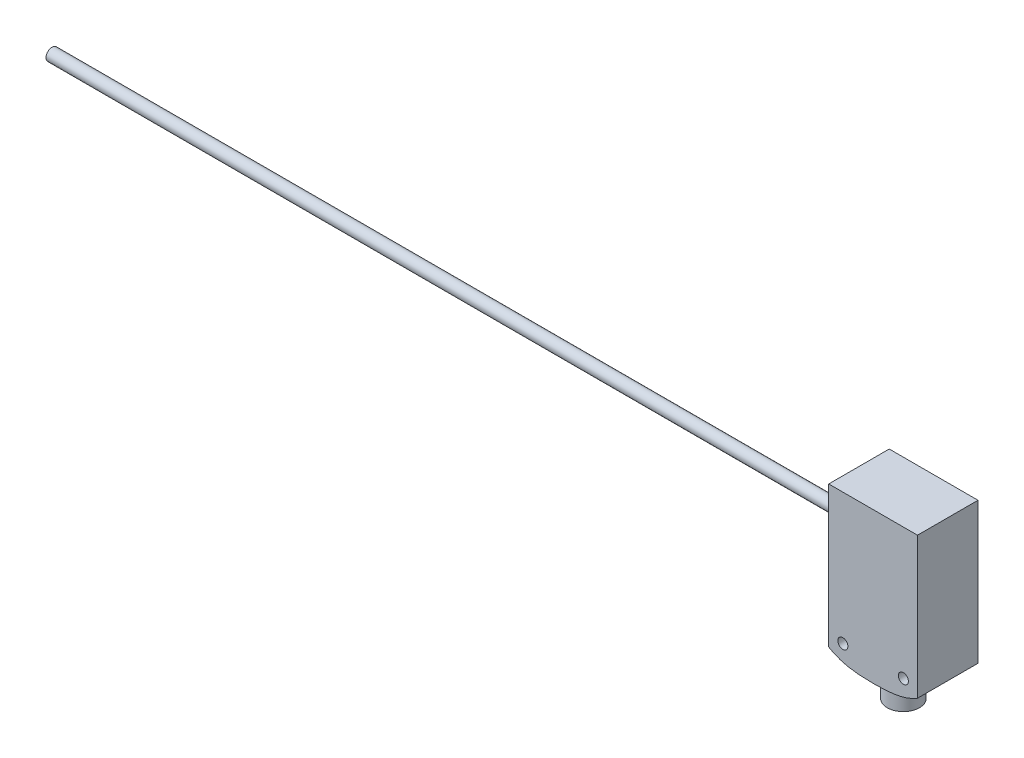
ISO-10303-21;
HEADER;
FILE_DESCRIPTION(('STEP AP214'),'2;1');
FILE_NAME('part.step','',(''),(''),'','','');
FILE_SCHEMA(('AUTOMOTIVE_DESIGN { 1 0 10303 214 1 1 1 1 }'));
ENDSEC;
DATA;
#1=APPLICATION_CONTEXT('core data for automotive mechanical design processes');
#2=APPLICATION_PROTOCOL_DEFINITION('international standard','automotive_design',2000,#1);
#3=PRODUCT_CONTEXT('',#1,'mechanical');
#4=PRODUCT('Part','Part','',(#3));
#5=PRODUCT_RELATED_PRODUCT_CATEGORY('part','',(#4));
#6=PRODUCT_DEFINITION_FORMATION('','',#4);
#7=PRODUCT_DEFINITION_CONTEXT('part definition',#1,'design');
#8=PRODUCT_DEFINITION('design','',#6,#7);
#9=PRODUCT_DEFINITION_SHAPE('','',#8);
#10=(LENGTH_UNIT() NAMED_UNIT(*) SI_UNIT(.MILLI.,.METRE.));
#11=(NAMED_UNIT(*) PLANE_ANGLE_UNIT() SI_UNIT($,.RADIAN.));
#12=(NAMED_UNIT(*) SI_UNIT($,.STERADIAN.) SOLID_ANGLE_UNIT());
#13=UNCERTAINTY_MEASURE_WITH_UNIT(LENGTH_MEASURE(1.E-05),#10,'distance_accuracy_value','');
#14=(GEOMETRIC_REPRESENTATION_CONTEXT(3) GLOBAL_UNCERTAINTY_ASSIGNED_CONTEXT((#13)) GLOBAL_UNIT_ASSIGNED_CONTEXT((#10,
#11,#12)) REPRESENTATION_CONTEXT('',''));
#15=CARTESIAN_POINT('',(0.,0.,0.));
#16=DIRECTION('',(0.,0.,1.));
#17=DIRECTION('',(1.,0.,0.));
#18=AXIS2_PLACEMENT_3D('',#15,#16,#17);
#19=CARTESIAN_POINT('',(-211.,32.8,7.5));
#20=DIRECTION('',(1.,0.,0.));
#21=DIRECTION('',(0.,0.,-1.));
#22=AXIS2_PLACEMENT_3D('',#19,#20,#21);
#23=CYLINDRICAL_SURFACE('',#22,1.5);
#24=CARTESIAN_POINT('',(-211.,32.8,7.5));
#25=DIRECTION('',(-1.,0.,0.));
#26=DIRECTION('',(0.,0.,1.));
#27=AXIS2_PLACEMENT_3D('',#24,#25,#26);
#28=CIRCLE('',#27,1.5);
#29=CARTESIAN_POINT('',(-211.,32.8,9.));
#30=VERTEX_POINT('',#29);
#31=EDGE_CURVE('E11',#30,#30,#28,.T.);
#32=ORIENTED_EDGE('',*,*,#31,.F.);
#33=EDGE_LOOP('',(#32));
#34=FACE_BOUND('',#33,.T.);
#35=CARTESIAN_POINT('',(-11.,32.8,7.5));
#36=DIRECTION('',(-1.,0.,0.));
#37=DIRECTION('',(0.,0.,1.));
#38=AXIS2_PLACEMENT_3D('',#35,#36,#37);
#39=CIRCLE('',#38,1.5);
#40=CARTESIAN_POINT('',(-11.,32.8,9.));
#41=VERTEX_POINT('',#40);
#42=EDGE_CURVE('E51',#41,#41,#39,.T.);
#43=ORIENTED_EDGE('',*,*,#42,.T.);
#44=EDGE_LOOP('',(#43));
#45=FACE_BOUND('',#44,.T.);
#46=ADVANCED_FACE('F48',(#34,#45),#23,.T.);
#47=CARTESIAN_POINT('',(-211.,32.8,7.5));
#48=DIRECTION('',(-1.,0.,0.));
#49=DIRECTION('',(0.,0.,1.));
#50=AXIS2_PLACEMENT_3D('',#47,#48,#49);
#51=PLANE('',#50);
#52=ORIENTED_EDGE('',*,*,#31,.T.);
#53=EDGE_LOOP('',(#52));
#54=FACE_BOUND('',#53,.T.);
#55=ADVANCED_FACE('F63',(#54),#51,.T.);
#56=CARTESIAN_POINT('',(-11.,32.8,7.5));
#57=DIRECTION('',(-1.,0.,0.));
#58=DIRECTION('',(0.,0.,1.));
#59=AXIS2_PLACEMENT_3D('',#56,#57,#58);
#60=PLANE('',#59);
#61=ORIENTED_EDGE('',*,*,#42,.F.);
#62=EDGE_LOOP('',(#61));
#63=FACE_BOUND('',#62,.T.);
#64=ADVANCED_FACE('F61',(#63),#60,.F.);
#65=CLOSED_SHELL('',(#46,#55,#64));
#66=MANIFOLD_SOLID_BREP('B2',#65);
#67=CARTESIAN_POINT('',(11.,9.3,0.));
#68=CARTESIAN_POINT('',(7.62537457172211,7.23673007694766,0.));
#69=CARTESIAN_POINT('',(0.,6.76326992305233,0.));
#70=CARTESIAN_POINT('',(-7.62537457172212,7.23673007694767,0.));
#71=CARTESIAN_POINT('',(-11.,9.3,0.));
#72=B_SPLINE_CURVE_WITH_KNOTS('',3,(#67,#68,#69,#70,#71),.UNSPECIFIED.,.F.,.F.,(4,1,4),(0.,0.5,
1.),.UNSPECIFIED.);
#73=DIRECTION('',(0.,0.,1.));
#74=VECTOR('',#73,1.);
#75=SURFACE_OF_LINEAR_EXTRUSION('',#72,#74);
#76=CARTESIAN_POINT('',(11.,9.3,15.));
#77=CARTESIAN_POINT('',(7.62537457172211,7.23673007694766,15.));
#78=CARTESIAN_POINT('',(0.,6.76326992305233,15.));
#79=CARTESIAN_POINT('',(-7.62537457172212,7.23673007694767,15.));
#80=CARTESIAN_POINT('',(-11.,9.3,15.));
#81=B_SPLINE_CURVE_WITH_KNOTS('',3,(#76,#77,#78,#79,#80),.UNSPECIFIED.,.F.,.F.,(4,1,4),(0.,0.5,
1.),.UNSPECIFIED.);
#82=CARTESIAN_POINT('',(11.,9.3,15.));
#83=VERTEX_POINT('',#82);
#84=CARTESIAN_POINT('',(-11.,9.3,15.));
#85=VERTEX_POINT('',#84);
#86=EDGE_CURVE('E121',#83,#85,#81,.T.);
#87=ORIENTED_EDGE('',*,*,#86,.T.);
#88=DIRECTION('',(0.,0.,1.));
#89=VECTOR('',#88,1.);
#90=CARTESIAN_POINT('',(-11.,9.3,0.));
#91=LINE('',#90,#89);
#92=CARTESIAN_POINT('',(-11.,9.3,0.));
#93=VERTEX_POINT('',#92);
#94=EDGE_CURVE('E210',#93,#85,#91,.T.);
#95=ORIENTED_EDGE('',*,*,#94,.F.);
#96=CARTESIAN_POINT('',(11.,9.3,0.));
#97=VERTEX_POINT('',#96);
#98=EDGE_CURVE('E204',#97,#93,#72,.T.);
#99=ORIENTED_EDGE('',*,*,#98,.F.);
#100=DIRECTION('',(0.,0.,1.));
#101=VECTOR('',#100,1.);
#102=CARTESIAN_POINT('',(11.,9.3,0.));
#103=LINE('',#102,#101);
#104=EDGE_CURVE('E289',#97,#83,#103,.T.);
#105=ORIENTED_EDGE('',*,*,#104,.T.);
#106=EDGE_LOOP('',(#87,#95,#99,#105));
#107=FACE_BOUND('',#106,.T.);
#108=CARTESIAN_POINT('',(0.,7.0000000000025,3.5));
#109=CARTESIAN_POINT('',(0.22439439935221,7.00000125301037,3.50000968765886));
#110=CARTESIAN_POINT('',(0.448941548053714,7.00083032711492,3.51894492720915));
#111=CARTESIAN_POINT('',(0.891836619614709,7.00469064216585,3.59421070501428));
#112=CARTESIAN_POINT('',(1.1101773529625,7.00772433691042,3.65058290551943));
#113=CARTESIAN_POINT('',(1.53419118893364,7.01619340560287,3.79909822405339));
#114=CARTESIAN_POINT('',(1.73987011840827,7.0216276652749,3.89122474350967));
#115=CARTESIAN_POINT('',(2.13277455188842,7.03464465181378,4.10858788356927));
#116=CARTESIAN_POINT('',(2.32000405926751,7.04222691119244,4.23381729929993));
#117=CARTESIAN_POINT('',(2.67093026662562,7.0588316517902,4.51393713770192));
#118=CARTESIAN_POINT('',(2.83460942713917,7.06785519598146,4.66884946899593));
#119=CARTESIAN_POINT('',(3.1336860014841,7.08624554735671,5.00391394182719));
#120=CARTESIAN_POINT('',(3.2690818212955,7.09561237385279,5.18406750497883));
#121=CARTESIAN_POINT('',(3.50804333172789,7.11341492256552,5.5649826127234));
#122=CARTESIAN_POINT('',(3.61153753175449,7.12184852675559,5.76578911714154));
#123=CARTESIAN_POINT('',(3.78332915841526,7.13649328392245,6.18200731252531));
#124=CARTESIAN_POINT('',(3.8516274551061,7.14270449183659,6.39741864230489));
#125=CARTESIAN_POINT('',(3.95094921563395,7.15191460960394,6.8362865058816));
#126=CARTESIAN_POINT('',(3.98204681856726,7.15491990737435,7.05972612069069));
#127=CARTESIAN_POINT('',(4.00630212930006,7.15725422466925,7.50867095156947));
#128=CARTESIAN_POINT('',(3.9994608596348,7.15658334327479,7.73417611180468));
#129=CARTESIAN_POINT('',(3.94814007204997,7.15168420569334,8.17995742511222));
#130=CARTESIAN_POINT('',(3.90380207147854,7.14746932534535,8.40025004185015));
#131=CARTESIAN_POINT('',(3.77895946361968,7.13617137316259,8.83026003320635));
#132=CARTESIAN_POINT('',(3.69845402501207,7.12908823540039,9.03997716462045));
#133=CARTESIAN_POINT('',(3.50337611853196,7.11312735717629,9.4433607158157));
#134=CARTESIAN_POINT('',(3.38873576309751,7.10424605188845,9.636994157503));
#135=CARTESIAN_POINT('',(3.12867708961996,7.08599077533882,10.0023301151966));
#136=CARTESIAN_POINT('',(2.98325818697742,7.07661679472183,10.1740322145455));
#137=CARTESIAN_POINT('',(2.66512868247824,7.05858666461076,10.4912768195617));
#138=CARTESIAN_POINT('',(2.49232028814389,7.04993326353616,10.6367214348943));
#139=CARTESIAN_POINT('',(2.12466316535358,7.03436825781713,10.8965368479663));
#140=CARTESIAN_POINT('',(1.92981482043195,7.02745662286963,11.0109081863183));
#141=CARTESIAN_POINT('',(1.52387172408515,7.01594501286417,11.2051883520305));
#142=CARTESIAN_POINT('',(1.31279551986721,7.0113424427169,11.285135852925));
#143=CARTESIAN_POINT('',(0.880059989222229,7.00452184208543,11.4084578922122));
#144=CARTESIAN_POINT('',(0.658400579974256,7.00230383026526,11.4518321443444));
#145=CARTESIAN_POINT('',(0.323236978926082,7.00051989291401,11.4885055729031));
#146=CARTESIAN_POINT('',(0.211122994039906,7.00018222531189,11.4960018386167));
#147=CARTESIAN_POINT('',(-0.0133389219275425,6.99992600531257,11.5015528789716));
#148=CARTESIAN_POINT('',(-0.12568685280814,7.00000745255602,11.4996076617082));
#149=CARTESIAN_POINT('',(-0.461845227837278,7.00094838404738,11.4795708849745));
#150=CARTESIAN_POINT('',(-0.684973670513185,7.00250335075343,11.4473002631626));
#151=CARTESIAN_POINT('',(-1.1225790417887,7.00793849795555,11.345821911616));
#152=CARTESIAN_POINT('',(-1.33705369436406,7.01181928596328,11.2766045317912));
#153=CARTESIAN_POINT('',(-1.7513468318626,7.02194588311564,11.1032181076615));
#154=CARTESIAN_POINT('',(-1.95116534848986,7.0281916871441,10.9990491389665));
#155=CARTESIAN_POINT('',(-2.3304512962829,7.04263131874652,10.7587433191008));
#156=CARTESIAN_POINT('',(-2.50991954721105,7.05082506781091,10.6226077563077));
#157=CARTESIAN_POINT('',(-2.84348916390995,7.06829726575762,10.3222232061028));
#158=CARTESIAN_POINT('',(-2.99758982669802,7.07757574468761,10.1579734398518));
#159=CARTESIAN_POINT('',(-3.27642756171496,7.09605308974232,9.80556421856531));
#160=CARTESIAN_POINT('',(-3.40109521253919,7.10525171931236,9.61734981667922));
#161=CARTESIAN_POINT('',(-3.61707554700771,7.1222304166689,9.22260841094127));
#162=CARTESIAN_POINT('',(-3.70838853523951,7.13001049740895,9.01608157433598));
#163=CARTESIAN_POINT('',(-3.85502441061273,7.14295876816829,8.5905991914311));
#164=CARTESIAN_POINT('',(-3.91035632365379,7.14812761314683,8.3716467770995));
#165=CARTESIAN_POINT('',(-3.9834511941488,7.15503100551879,7.92750789887446));
#166=CARTESIAN_POINT('',(-4.00121537258515,7.15676566452598,7.70232163782716));
#167=CARTESIAN_POINT('',(-3.99866055369119,7.15651932659909,7.25311340602665));
#168=CARTESIAN_POINT('',(-3.97850055916513,7.15455384304398,7.02909050546339));
#169=CARTESIAN_POINT('',(-3.90100026312252,7.14725524940516,6.58762832586644));
#170=CARTESIAN_POINT('',(-3.84365956498467,7.14192210339727,6.3701891170895));
#171=CARTESIAN_POINT('',(-3.69346018327395,7.12873130883833,5.94805289599994));
#172=CARTESIAN_POINT('',(-3.60060444556894,7.12087386967861,5.74335482848419));
#173=CARTESIAN_POINT('',(-3.38201248723207,7.10382373893622,5.35240891204786));
#174=CARTESIAN_POINT('',(-3.25627658212902,7.09463106016732,5.16616088609832));
#175=CARTESIAN_POINT('',(-2.97487023447592,7.07617091787339,4.81658785543776));
#176=CARTESIAN_POINT('',(-2.8190797314892,7.06690330225173,4.65335949440853));
#177=CARTESIAN_POINT('',(-2.48223152004462,7.04950926519354,4.35530517753812));
#178=CARTESIAN_POINT('',(-2.30116811073027,7.04138310206867,4.22048564719783));
#179=CARTESIAN_POINT('',(-1.91876631928339,7.0271150189966,3.98303338976419));
#180=CARTESIAN_POINT('',(-1.71741021338652,7.02097485367991,3.88042912721317));
#181=CARTESIAN_POINT('',(-1.30041846346927,7.01109150954002,3.71060938927216));
#182=CARTESIAN_POINT('',(-1.08479936310078,7.00734560559905,3.64335369614758));
#183=CARTESIAN_POINT('',(-0.72326324519807,7.00307866185629,3.56324013931602));
#184=CARTESIAN_POINT('',(-0.57966043865072,7.00188566200386,3.53955626817374));
#185=CARTESIAN_POINT('',(-0.290726470393572,7.00034592296466,3.50793301956921));
#186=CARTESIAN_POINT('',(-0.145395299815608,6.99999918812192,3.49999372292683));
#187=CARTESIAN_POINT('',(0.,7.0000000000025,3.5));
#188=B_SPLINE_CURVE_WITH_KNOTS('',3,(#108,#109,#110,#111,#112,#113,#114,#115,#116,#117,#118,
#119,#120,#121,#122,#123,#124,#125,#126,#127,#128,#129,#130,#131,#132,#133,#134,#135,#136,#137,
#138,#139,#140,#141,#142,#143,#144,#145,#146,#147,#148,#149,#150,#151,#152,#153,#154,#155,#156,
#157,#158,#159,#160,#161,#162,#163,#164,#165,#166,#167,#168,#169,#170,#171,#172,#173,#174,#175,
#176,#177,#178,#179,#180,#181,#182,#183,#184,#185,#186,#187),.UNSPECIFIED.,.T.,.F.,(4,2,2,2,2,2,
2,2,2,2,2,2,2,2,2,2,2,2,2,2,2,2,2,2,2,2,2,2,2,2,2,2,2,2,2,2,2,2,2,4),(0.,0.672653279328891,
1.34605638757915,2.01914724863845,2.69209173136937,3.36553483348842,4.03901587993393,
4.7139953856385,5.38895820478188,6.06257360420852,6.73617084832115,7.40723713943914,
8.07831885602041,8.75074423800014,9.42318239299291,10.0980778985217,10.7729616614747,
11.4470852339066,12.1212140826888,12.4579642312003,12.794714090973,13.4676077797968,
14.1406773071703,14.81374537852,15.4867863272735,16.1598459240947,16.8344775005462,
17.5091029162553,18.1835590359498,18.8579932349266,19.5296060674845,20.2012260645206,
20.8727903647343,21.5443482206343,22.2186465105323,22.8930971497007,23.5681420490864,
24.2424172463255,24.6782575501707,25.1141000912604),.UNSPECIFIED.);
#189=CARTESIAN_POINT('',(0.,7.0000000000025,3.5));
#190=VERTEX_POINT('',#189);
#191=EDGE_CURVE('E46',#190,#190,#188,.T.);
#192=ORIENTED_EDGE('',*,*,#191,.F.);
#193=EDGE_LOOP('',(#192));
#194=FACE_BOUND('',#193,.T.);
#195=ADVANCED_FACE('F94',(#107,#194),#75,.F.);
#196=CARTESIAN_POINT('',(0.,0.,15.));
#197=DIRECTION('',(0.,0.,1.));
#198=DIRECTION('',(1.,0.,0.));
#199=AXIS2_PLACEMENT_3D('',#196,#197,#198);
#200=PLANE('',#199);
#201=ORIENTED_EDGE('',*,*,#86,.F.);
#202=DIRECTION('',(0.,1.,0.));
#203=VECTOR('',#202,1.);
#204=CARTESIAN_POINT('',(11.,0.,15.));
#205=LINE('',#204,#203);
#206=CARTESIAN_POINT('',(11.,44.3,15.));
#207=VERTEX_POINT('',#206);
#208=EDGE_CURVE('E271',#83,#207,#205,.T.);
#209=ORIENTED_EDGE('',*,*,#208,.T.);
#210=DIRECTION('',(-1.,0.,0.));
#211=VECTOR('',#210,1.);
#212=CARTESIAN_POINT('',(11.,44.3,15.));
#213=LINE('',#212,#211);
#214=CARTESIAN_POINT('',(-11.,44.3,15.));
#215=VERTEX_POINT('',#214);
#216=EDGE_CURVE('E273',#207,#215,#213,.T.);
#217=ORIENTED_EDGE('',*,*,#216,.T.);
#218=DIRECTION('',(0.,-1.,0.));
#219=VECTOR('',#218,1.);
#220=CARTESIAN_POINT('',(-11.,0.,15.));
#221=LINE('',#220,#219);
#222=EDGE_CURVE('E268',#215,#85,#221,.T.);
#223=ORIENTED_EDGE('',*,*,#222,.T.);
#224=EDGE_LOOP('',(#201,#209,#217,#223));
#225=FACE_BOUND('',#224,.T.);
#226=CARTESIAN_POINT('',(7.5,11.8,15.));
#227=DIRECTION('',(0.,0.,1.));
#228=DIRECTION('',(1.,0.,0.));
#229=AXIS2_PLACEMENT_3D('',#226,#227,#228);
#230=CIRCLE('',#229,1.25);
#231=CARTESIAN_POINT('',(8.75,11.8,15.));
#232=VERTEX_POINT('',#231);
#233=EDGE_CURVE('E277',#232,#232,#230,.T.);
#234=ORIENTED_EDGE('',*,*,#233,.F.);
#235=EDGE_LOOP('',(#234));
#236=FACE_BOUND('',#235,.T.);
#237=CARTESIAN_POINT('',(-7.5,11.8,15.));
#238=DIRECTION('',(0.,0.,1.));
#239=DIRECTION('',(-1.,0.,0.));
#240=AXIS2_PLACEMENT_3D('',#237,#238,#239);
#241=CIRCLE('',#240,1.25);
#242=CARTESIAN_POINT('',(-8.75,11.8,15.));
#243=VERTEX_POINT('',#242);
#244=EDGE_CURVE('E283',#243,#243,#241,.T.);
#245=ORIENTED_EDGE('',*,*,#244,.F.);
#246=EDGE_LOOP('',(#245));
#247=FACE_BOUND('',#246,.T.);
#248=ADVANCED_FACE('F220',(#225,#236,#247),#200,.T.);
#249=CARTESIAN_POINT('',(0.,0.,0.));
#250=DIRECTION('',(0.,0.,1.));
#251=DIRECTION('',(1.,0.,0.));
#252=AXIS2_PLACEMENT_3D('',#249,#250,#251);
#253=PLANE('',#252);
#254=CARTESIAN_POINT('',(7.5,11.8,0.));
#255=DIRECTION('',(0.,0.,1.));
#256=DIRECTION('',(1.,0.,0.));
#257=AXIS2_PLACEMENT_3D('',#254,#255,#256);
#258=CIRCLE('',#257,1.25);
#259=CARTESIAN_POINT('',(8.75,11.8,0.));
#260=VERTEX_POINT('',#259);
#261=EDGE_CURVE('E280',#260,#260,#258,.T.);
#262=ORIENTED_EDGE('',*,*,#261,.T.);
#263=EDGE_LOOP('',(#262));
#264=FACE_BOUND('',#263,.T.);
#265=DIRECTION('',(0.,1.,0.));
#266=VECTOR('',#265,1.);
#267=CARTESIAN_POINT('',(11.,0.,0.));
#268=LINE('',#267,#266);
#269=CARTESIAN_POINT('',(11.,44.3,0.));
#270=VERTEX_POINT('',#269);
#271=EDGE_CURVE('E263',#97,#270,#268,.T.);
#272=ORIENTED_EDGE('',*,*,#271,.F.);
#273=ORIENTED_EDGE('',*,*,#98,.T.);
#274=DIRECTION('',(0.,-1.,0.));
#275=VECTOR('',#274,1.);
#276=CARTESIAN_POINT('',(-11.,0.,0.));
#277=LINE('',#276,#275);
#278=CARTESIAN_POINT('',(-11.,44.3,0.));
#279=VERTEX_POINT('',#278);
#280=EDGE_CURVE('E262',#279,#93,#277,.T.);
#281=ORIENTED_EDGE('',*,*,#280,.F.);
#282=DIRECTION('',(-1.,0.,0.));
#283=VECTOR('',#282,1.);
#284=CARTESIAN_POINT('',(11.,44.3,0.));
#285=LINE('',#284,#283);
#286=EDGE_CURVE('E253',#270,#279,#285,.T.);
#287=ORIENTED_EDGE('',*,*,#286,.F.);
#288=EDGE_LOOP('',(#272,#273,#281,#287));
#289=FACE_BOUND('',#288,.T.);
#290=CARTESIAN_POINT('',(-7.5,11.8,0.));
#291=DIRECTION('',(0.,0.,1.));
#292=DIRECTION('',(-1.,0.,0.));
#293=AXIS2_PLACEMENT_3D('',#290,#291,#292);
#294=CIRCLE('',#293,1.25);
#295=CARTESIAN_POINT('',(-8.75,11.8,0.));
#296=VERTEX_POINT('',#295);
#297=EDGE_CURVE('E286',#296,#296,#294,.T.);
#298=ORIENTED_EDGE('',*,*,#297,.T.);
#299=EDGE_LOOP('',(#298));
#300=FACE_BOUND('',#299,.T.);
#301=ADVANCED_FACE('F236',(#264,#289,#300),#253,.F.);
#302=CARTESIAN_POINT('',(11.,0.,15.));
#303=DIRECTION('',(-1.,0.,0.));
#304=DIRECTION('',(0.,0.,1.));
#305=AXIS2_PLACEMENT_3D('',#302,#303,#304);
#306=PLANE('',#305);
#307=ORIENTED_EDGE('',*,*,#208,.F.);
#308=ORIENTED_EDGE('',*,*,#104,.F.);
#309=ORIENTED_EDGE('',*,*,#271,.T.);
#310=DIRECTION('',(0.,0.,-1.));
#311=VECTOR('',#310,1.);
#312=CARTESIAN_POINT('',(11.,44.3,15.));
#313=LINE('',#312,#311);
#314=EDGE_CURVE('E106',#207,#270,#313,.T.);
#315=ORIENTED_EDGE('',*,*,#314,.F.);
#316=EDGE_LOOP('',(#307,#308,#309,#315));
#317=FACE_BOUND('',#316,.T.);
#318=ADVANCED_FACE('F96',(#317),#306,.F.);
#319=CARTESIAN_POINT('',(11.,44.3,15.));
#320=DIRECTION('',(0.,-1.,0.));
#321=DIRECTION('',(0.,0.,-1.));
#322=AXIS2_PLACEMENT_3D('',#319,#320,#321);
#323=PLANE('',#322);
#324=ORIENTED_EDGE('',*,*,#286,.T.);
#325=DIRECTION('',(0.,0.,-1.));
#326=VECTOR('',#325,1.);
#327=CARTESIAN_POINT('',(-11.,44.3,15.));
#328=LINE('',#327,#326);
#329=EDGE_CURVE('E256',#215,#279,#328,.T.);
#330=ORIENTED_EDGE('',*,*,#329,.F.);
#331=ORIENTED_EDGE('',*,*,#216,.F.);
#332=ORIENTED_EDGE('',*,*,#314,.T.);
#333=EDGE_LOOP('',(#324,#330,#331,#332));
#334=FACE_BOUND('',#333,.T.);
#335=ADVANCED_FACE('F242',(#334),#323,.F.);
#336=CARTESIAN_POINT('',(-11.,0.,15.));
#337=DIRECTION('',(1.,0.,0.));
#338=DIRECTION('',(0.,0.,-1.));
#339=AXIS2_PLACEMENT_3D('',#336,#337,#338);
#340=PLANE('',#339);
#341=DIRECTION('',(0.,0.,-1.));
#342=VECTOR('',#341,1.);
#343=CARTESIAN_POINT('',(-11.,37.8,1.3));
#344=LINE('',#343,#342);
#345=CARTESIAN_POINT('',(-11.,37.8,13.7));
#346=VERTEX_POINT('',#345);
#347=CARTESIAN_POINT('',(-11.,37.8,1.3));
#348=VERTEX_POINT('',#347);
#349=EDGE_CURVE('E192',#346,#348,#344,.T.);
#350=ORIENTED_EDGE('',*,*,#349,.F.);
#351=DIRECTION('',(0.,1.,0.));
#352=VECTOR('',#351,1.);
#353=CARTESIAN_POINT('',(-11.,37.8,13.7));
#354=LINE('',#353,#352);
#355=CARTESIAN_POINT('',(-11.,16.8,13.7));
#356=VERTEX_POINT('',#355);
#357=EDGE_CURVE('E113',#356,#346,#354,.T.);
#358=ORIENTED_EDGE('',*,*,#357,.F.);
#359=CARTESIAN_POINT('',(-11.,35.8147311314149,7.5));
#360=DIRECTION('',(-1.,0.,0.));
#361=DIRECTION('',(0.,0.,1.));
#362=AXIS2_PLACEMENT_3D('',#359,#360,#361);
#363=CIRCLE('',#362,20.);
#364=CARTESIAN_POINT('',(-11.,16.8,1.3));
#365=VERTEX_POINT('',#364);
#366=EDGE_CURVE('E183',#365,#356,#363,.T.);
#367=ORIENTED_EDGE('',*,*,#366,.F.);
#368=DIRECTION('',(0.,-1.,0.));
#369=VECTOR('',#368,1.);
#370=CARTESIAN_POINT('',(-11.,37.8,1.3));
#371=LINE('',#370,#369);
#372=EDGE_CURVE('E186',#348,#365,#371,.T.);
#373=ORIENTED_EDGE('',*,*,#372,.F.);
#374=EDGE_LOOP('',(#350,#358,#367,#373));
#375=FACE_BOUND('',#374,.T.);
#376=ORIENTED_EDGE('',*,*,#280,.T.);
#377=ORIENTED_EDGE('',*,*,#94,.T.);
#378=ORIENTED_EDGE('',*,*,#222,.F.);
#379=ORIENTED_EDGE('',*,*,#329,.T.);
#380=EDGE_LOOP('',(#376,#377,#378,#379));
#381=FACE_BOUND('',#380,.T.);
#382=ADVANCED_FACE('F232',(#375,#381),#340,.F.);
#383=CARTESIAN_POINT('',(7.5,11.8,15.));
#384=DIRECTION('',(0.,0.,-1.));
#385=DIRECTION('',(-1.,0.,0.));
#386=AXIS2_PLACEMENT_3D('',#383,#384,#385);
#387=CYLINDRICAL_SURFACE('',#386,1.25);
#388=ORIENTED_EDGE('',*,*,#233,.T.);
#389=EDGE_LOOP('',(#388));
#390=FACE_BOUND('',#389,.T.);
#391=ORIENTED_EDGE('',*,*,#261,.F.);
#392=EDGE_LOOP('',(#391));
#393=FACE_BOUND('',#392,.T.);
#394=ADVANCED_FACE('F228',(#390,#393),#387,.F.);
#395=CARTESIAN_POINT('',(-7.5,11.8,15.));
#396=DIRECTION('',(0.,0.,-1.));
#397=DIRECTION('',(-1.,0.,0.));
#398=AXIS2_PLACEMENT_3D('',#395,#396,#397);
#399=CYLINDRICAL_SURFACE('',#398,1.25);
#400=ORIENTED_EDGE('',*,*,#244,.T.);
#401=EDGE_LOOP('',(#400));
#402=FACE_BOUND('',#401,.T.);
#403=ORIENTED_EDGE('',*,*,#297,.F.);
#404=EDGE_LOOP('',(#403));
#405=FACE_BOUND('',#404,.T.);
#406=ADVANCED_FACE('F224',(#402,#405),#399,.F.);
#407=CARTESIAN_POINT('',(0.,0.,7.5));
#408=DIRECTION('',(0.,1.,0.));
#409=DIRECTION('',(0.,0.,1.));
#410=AXIS2_PLACEMENT_3D('',#407,#408,#409);
#411=PLANE('',#410);
#412=CARTESIAN_POINT('',(0.,0.,7.5));
#413=DIRECTION('',(0.,1.,0.));
#414=DIRECTION('',(0.,0.,1.));
#415=AXIS2_PLACEMENT_3D('',#412,#413,#414);
#416=CIRCLE('',#415,4.);
#417=CARTESIAN_POINT('',(0.,0.,11.5));
#418=VERTEX_POINT('',#417);
#419=EDGE_CURVE('E198',#418,#418,#416,.T.);
#420=ORIENTED_EDGE('',*,*,#419,.F.);
#421=EDGE_LOOP('',(#420));
#422=FACE_BOUND('',#421,.T.);
#423=ADVANCED_FACE('F227',(#422),#411,.F.);
#424=CARTESIAN_POINT('',(0.,500000.,7.5));
#425=DIRECTION('',(0.,-1.,0.));
#426=DIRECTION('',(0.,0.,-1.));
#427=AXIS2_PLACEMENT_3D('',#424,#425,#426);
#428=CYLINDRICAL_SURFACE('',#427,4.);
#429=ORIENTED_EDGE('',*,*,#419,.T.);
#430=EDGE_LOOP('',(#429));
#431=FACE_BOUND('',#430,.T.);
#432=ORIENTED_EDGE('',*,*,#191,.T.);
#433=EDGE_LOOP('',(#432));
#434=FACE_BOUND('',#433,.T.);
#435=ADVANCED_FACE('F221',(#431,#434),#428,.T.);
#436=CARTESIAN_POINT('',(-10.9,37.8,13.7));
#437=DIRECTION('',(0.,0.,1.));
#438=DIRECTION('',(0.,-1.,0.));
#439=AXIS2_PLACEMENT_3D('',#436,#437,#438);
#440=PLANE('',#439);
#441=ORIENTED_EDGE('',*,*,#357,.T.);
#442=DIRECTION('',(-1.,0.,0.));
#443=VECTOR('',#442,1.);
#444=CARTESIAN_POINT('',(-10.9,37.8,13.7));
#445=LINE('',#444,#443);
#446=CARTESIAN_POINT('',(-10.9,37.8,13.7));
#447=VERTEX_POINT('',#446);
#448=EDGE_CURVE('E161',#447,#346,#445,.T.);
#449=ORIENTED_EDGE('',*,*,#448,.F.);
#450=DIRECTION('',(0.,1.,0.));
#451=VECTOR('',#450,1.);
#452=CARTESIAN_POINT('',(-10.9,37.8,13.7));
#453=LINE('',#452,#451);
#454=CARTESIAN_POINT('',(-10.9,16.8,13.7));
#455=VERTEX_POINT('',#454);
#456=EDGE_CURVE('E165',#455,#447,#453,.T.);
#457=ORIENTED_EDGE('',*,*,#456,.F.);
#458=DIRECTION('',(-1.,0.,0.));
#459=VECTOR('',#458,1.);
#460=CARTESIAN_POINT('',(-10.9,16.8,13.7));
#461=LINE('',#460,#459);
#462=EDGE_CURVE('E196',#455,#356,#461,.T.);
#463=ORIENTED_EDGE('',*,*,#462,.T.);
#464=EDGE_LOOP('',(#441,#449,#457,#463));
#465=FACE_BOUND('',#464,.T.);
#466=ADVANCED_FACE('F163',(#465),#440,.F.);
#467=CARTESIAN_POINT('',(-10.9,35.8147311314149,7.5));
#468=DIRECTION('',(-1.,0.,0.));
#469=DIRECTION('',(0.,0.,1.));
#470=AXIS2_PLACEMENT_3D('',#467,#468,#469);
#471=CYLINDRICAL_SURFACE('',#470,20.);
#472=ORIENTED_EDGE('',*,*,#366,.T.);
#473=ORIENTED_EDGE('',*,*,#462,.F.);
#474=CARTESIAN_POINT('',(-10.9,35.8147311314149,7.5));
#475=DIRECTION('',(-1.,0.,0.));
#476=DIRECTION('',(0.,0.,1.));
#477=AXIS2_PLACEMENT_3D('',#474,#475,#476);
#478=CIRCLE('',#477,20.);
#479=CARTESIAN_POINT('',(-10.9,16.8,1.3));
#480=VERTEX_POINT('',#479);
#481=EDGE_CURVE('E171',#480,#455,#478,.T.);
#482=ORIENTED_EDGE('',*,*,#481,.F.);
#483=DIRECTION('',(-1.,0.,0.));
#484=VECTOR('',#483,1.);
#485=CARTESIAN_POINT('',(-10.9,16.8,1.3));
#486=LINE('',#485,#484);
#487=EDGE_CURVE('E199',#480,#365,#486,.T.);
#488=ORIENTED_EDGE('',*,*,#487,.T.);
#489=EDGE_LOOP('',(#472,#473,#482,#488));
#490=FACE_BOUND('',#489,.T.);
#491=ADVANCED_FACE('F311',(#490),#471,.F.);
#492=CARTESIAN_POINT('',(-10.9,37.8,1.3));
#493=DIRECTION('',(0.,0.,-1.));
#494=DIRECTION('',(0.,1.,0.));
#495=AXIS2_PLACEMENT_3D('',#492,#493,#494);
#496=PLANE('',#495);
#497=ORIENTED_EDGE('',*,*,#372,.T.);
#498=ORIENTED_EDGE('',*,*,#487,.F.);
#499=DIRECTION('',(0.,-1.,0.));
#500=VECTOR('',#499,1.);
#501=CARTESIAN_POINT('',(-10.9,37.8,1.3));
#502=LINE('',#501,#500);
#503=CARTESIAN_POINT('',(-10.9,37.8,1.3));
#504=VERTEX_POINT('',#503);
#505=EDGE_CURVE('E179',#504,#480,#502,.T.);
#506=ORIENTED_EDGE('',*,*,#505,.F.);
#507=DIRECTION('',(-1.,0.,0.));
#508=VECTOR('',#507,1.);
#509=CARTESIAN_POINT('',(-10.9,37.8,1.3));
#510=LINE('',#509,#508);
#511=EDGE_CURVE('E170',#504,#348,#510,.T.);
#512=ORIENTED_EDGE('',*,*,#511,.T.);
#513=EDGE_LOOP('',(#497,#498,#506,#512));
#514=FACE_BOUND('',#513,.T.);
#515=ADVANCED_FACE('F320',(#514),#496,.F.);
#516=CARTESIAN_POINT('',(-10.9,37.8,1.3));
#517=DIRECTION('',(0.,1.,0.));
#518=DIRECTION('',(0.,0.,1.));
#519=AXIS2_PLACEMENT_3D('',#516,#517,#518);
#520=PLANE('',#519);
#521=ORIENTED_EDGE('',*,*,#349,.T.);
#522=ORIENTED_EDGE('',*,*,#511,.F.);
#523=DIRECTION('',(0.,0.,-1.));
#524=VECTOR('',#523,1.);
#525=CARTESIAN_POINT('',(-10.9,37.8,1.3));
#526=LINE('',#525,#524);
#527=EDGE_CURVE('E174',#447,#504,#526,.T.);
#528=ORIENTED_EDGE('',*,*,#527,.F.);
#529=ORIENTED_EDGE('',*,*,#448,.T.);
#530=EDGE_LOOP('',(#521,#522,#528,#529));
#531=FACE_BOUND('',#530,.T.);
#532=ADVANCED_FACE('F175',(#531),#520,.F.);
#533=CARTESIAN_POINT('',(-10.9,35.8147311314149,7.5));
#534=DIRECTION('',(-1.,0.,0.));
#535=DIRECTION('',(0.,0.,1.));
#536=AXIS2_PLACEMENT_3D('',#533,#534,#535);
#537=PLANE('',#536);
#538=ORIENTED_EDGE('',*,*,#456,.T.);
#539=ORIENTED_EDGE('',*,*,#527,.T.);
#540=ORIENTED_EDGE('',*,*,#505,.T.);
#541=ORIENTED_EDGE('',*,*,#481,.T.);
#542=EDGE_LOOP('',(#538,#539,#540,#541));
#543=FACE_BOUND('',#542,.T.);
#544=ADVANCED_FACE('F181',(#543),#537,.T.);
#545=CLOSED_SHELL('',(#195,#248,#301,#318,#335,#382,#394,#406,#423,#435,#466,#491,#515,#532,#544));
#546=MANIFOLD_SOLID_BREP('B6',#545);
#547=ADVANCED_BREP_SHAPE_REPRESENTATION('',(#18,#66,#546),#14);
#548=SHAPE_DEFINITION_REPRESENTATION(#9,#547);
ENDSEC;
END-ISO-10303-21;
